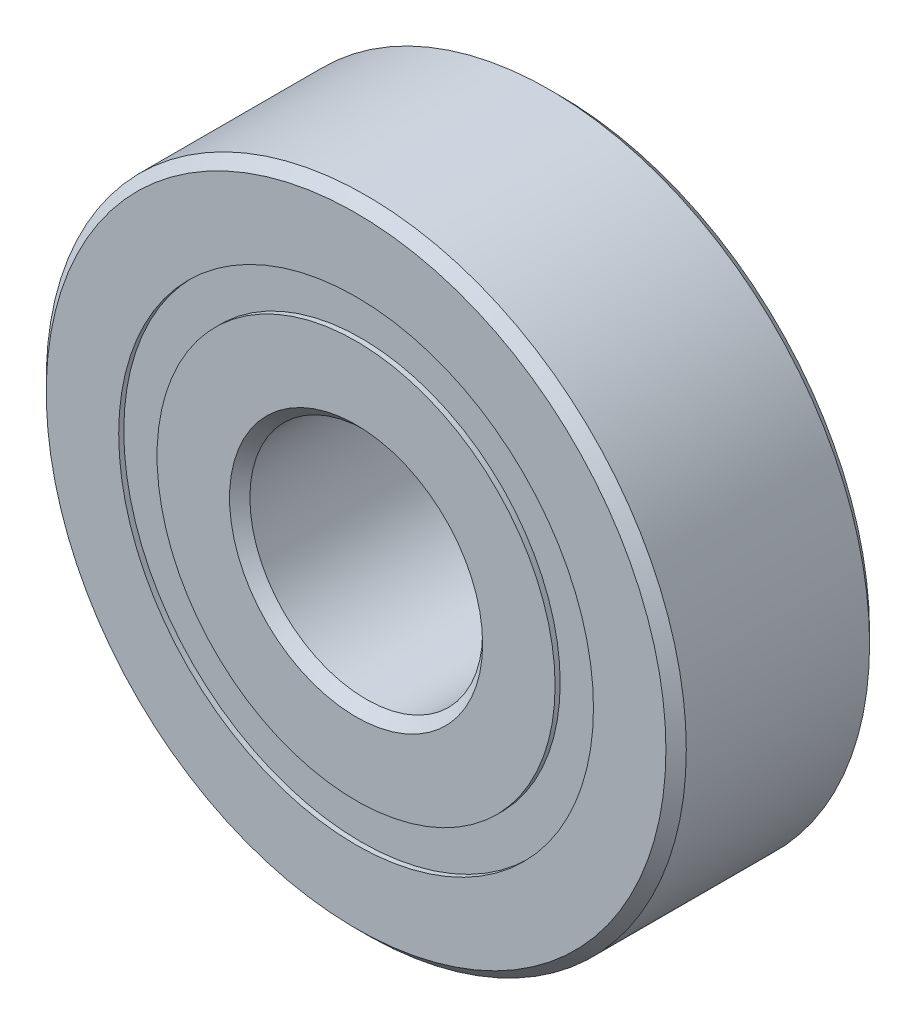
ISO-10303-21;
HEADER;
FILE_DESCRIPTION(('STEP AP214'),'2;1');
FILE_NAME('part.step','',(''),(''),'','','');
FILE_SCHEMA(('AUTOMOTIVE_DESIGN { 1 0 10303 214 1 1 1 1 }'));
ENDSEC;
DATA;
#1=APPLICATION_CONTEXT('core data for automotive mechanical design processes');
#2=APPLICATION_PROTOCOL_DEFINITION('international standard','automotive_design',2000,#1);
#3=PRODUCT_CONTEXT('',#1,'mechanical');
#4=PRODUCT('Part','Part','',(#3));
#5=PRODUCT_RELATED_PRODUCT_CATEGORY('part','',(#4));
#6=PRODUCT_DEFINITION_FORMATION('','',#4);
#7=PRODUCT_DEFINITION_CONTEXT('part definition',#1,'design');
#8=PRODUCT_DEFINITION('design','',#6,#7);
#9=PRODUCT_DEFINITION_SHAPE('','',#8);
#10=(LENGTH_UNIT() NAMED_UNIT(*) SI_UNIT(.MILLI.,.METRE.));
#11=(NAMED_UNIT(*) PLANE_ANGLE_UNIT() SI_UNIT($,.RADIAN.));
#12=(NAMED_UNIT(*) SI_UNIT($,.STERADIAN.) SOLID_ANGLE_UNIT());
#13=UNCERTAINTY_MEASURE_WITH_UNIT(LENGTH_MEASURE(1.E-05),#10,'distance_accuracy_value','');
#14=(GEOMETRIC_REPRESENTATION_CONTEXT(3) GLOBAL_UNCERTAINTY_ASSIGNED_CONTEXT((#13)) GLOBAL_UNIT_ASSIGNED_CONTEXT((#10,
#11,#12)) REPRESENTATION_CONTEXT('',''));
#15=CARTESIAN_POINT('',(0.,0.,0.));
#16=DIRECTION('',(0.,0.,1.));
#17=DIRECTION('',(1.,0.,0.));
#18=AXIS2_PLACEMENT_3D('',#15,#16,#17);
#19=CARTESIAN_POINT('',(0.,0.,3.5));
#20=DIRECTION('',(0.,0.,1.));
#21=DIRECTION('',(1.,0.,0.));
#22=AXIS2_PLACEMENT_3D('',#19,#20,#21);
#23=CYLINDRICAL_SURFACE('',#22,8.15934065934066);
#24=CARTESIAN_POINT('',(0.,0.,3.325));
#25=DIRECTION('',(0.,0.,1.));
#26=DIRECTION('',(1.,0.,0.));
#27=AXIS2_PLACEMENT_3D('',#24,#25,#26);
#28=CIRCLE('',#27,8.15934065934066);
#29=CARTESIAN_POINT('',(8.15934065934066,0.,3.325));
#30=VERTEX_POINT('',#29);
#31=EDGE_CURVE('P0_E43',#30,#30,#28,.T.);
#32=ORIENTED_EDGE('',*,*,#31,.F.);
#33=EDGE_LOOP('',(#32));
#34=FACE_BOUND('',#33,.T.);
#35=CARTESIAN_POINT('',(0.,0.,1.68952158656808));
#36=DIRECTION('',(0.,0.,1.));
#37=DIRECTION('',(1.,0.,0.));
#38=AXIS2_PLACEMENT_3D('',#35,#36,#37);
#39=CIRCLE('',#38,8.15934065934066);
#40=CARTESIAN_POINT('',(8.15934065934066,0.,1.68952158656808));
#41=VERTEX_POINT('',#40);
#42=EDGE_CURVE('P0_E11',#41,#41,#39,.T.);
#43=ORIENTED_EDGE('',*,*,#42,.T.);
#44=EDGE_LOOP('',(#43));
#45=FACE_BOUND('',#44,.T.);
#46=ADVANCED_FACE('P0_F16',(#34,#45),#23,.T.);
#47=CARTESIAN_POINT('',(0.,8.15934065934066,1.68952158656808));
#48=DIRECTION('',(0.,0.,1.));
#49=DIRECTION('',(1.,0.,0.));
#50=AXIS2_PLACEMENT_3D('',#47,#48,#49);
#51=PLANE('',#50);
#52=CARTESIAN_POINT('',(0.,0.,1.68952158656808));
#53=DIRECTION('',(0.,0.,1.));
#54=DIRECTION('',(1.,0.,0.));
#55=AXIS2_PLACEMENT_3D('',#52,#53,#54);
#56=CIRCLE('',#55,6.84065934065934);
#57=CARTESIAN_POINT('',(6.84065934065934,0.,1.68952158656808));
#58=VERTEX_POINT('',#57);
#59=EDGE_CURVE('P0_E19',#58,#58,#56,.T.);
#60=ORIENTED_EDGE('',*,*,#59,.T.);
#61=EDGE_LOOP('',(#60));
#62=FACE_BOUND('',#61,.T.);
#63=ORIENTED_EDGE('',*,*,#42,.F.);
#64=EDGE_LOOP('',(#63));
#65=FACE_BOUND('',#64,.T.);
#66=ADVANCED_FACE('P0_F100',(#62,#65),#51,.F.);
#67=CARTESIAN_POINT('',(0.,0.,3.5));
#68=DIRECTION('',(0.,0.,1.));
#69=DIRECTION('',(1.,0.,0.));
#70=AXIS2_PLACEMENT_3D('',#67,#68,#69);
#71=CYLINDRICAL_SURFACE('',#70,6.84065934065934);
#72=ORIENTED_EDGE('',*,*,#59,.F.);
#73=EDGE_LOOP('',(#72));
#74=FACE_BOUND('',#73,.T.);
#75=CARTESIAN_POINT('',(0.,0.,3.325));
#76=DIRECTION('',(0.,0.,1.));
#77=DIRECTION('',(1.,0.,0.));
#78=AXIS2_PLACEMENT_3D('',#75,#76,#77);
#79=CIRCLE('',#78,6.84065934065934);
#80=CARTESIAN_POINT('',(6.84065934065934,0.,3.325));
#81=VERTEX_POINT('',#80);
#82=EDGE_CURVE('P0_E48',#81,#81,#79,.T.);
#83=ORIENTED_EDGE('',*,*,#82,.T.);
#84=EDGE_LOOP('',(#83));
#85=FACE_BOUND('',#84,.T.);
#86=ADVANCED_FACE('P0_F49',(#74,#85),#71,.F.);
#87=CARTESIAN_POINT('',(0.,8.15934065934066,3.325));
#88=DIRECTION('',(0.,0.,-1.));
#89=DIRECTION('',(0.,-1.,0.));
#90=AXIS2_PLACEMENT_3D('',#87,#88,#89);
#91=PLANE('',#90);
#92=ORIENTED_EDGE('',*,*,#82,.F.);
#93=EDGE_LOOP('',(#92));
#94=FACE_BOUND('',#93,.T.);
#95=ORIENTED_EDGE('',*,*,#31,.T.);
#96=EDGE_LOOP('',(#95));
#97=FACE_BOUND('',#96,.T.);
#98=ADVANCED_FACE('P0_F84',(#94,#97),#91,.F.);
#99=CLOSED_SHELL('',(#46,#66,#86,#98));
#100=MANIFOLD_SOLID_BREP('P0_B1',#99);
#101=CARTESIAN_POINT('',(0.,0.,0.));
#102=DIRECTION('',(0.,0.,1.));
#103=DIRECTION('',(1.,0.,0.));
#104=AXIS2_PLACEMENT_3D('',#101,#102,#103);
#105=PLANE('',#104);
#106=CARTESIAN_POINT('',(0.,7.5,0.));
#107=DIRECTION('',(0.,0.,1.));
#108=DIRECTION('',(1.,0.,0.));
#109=AXIS2_PLACEMENT_3D('',#106,#107,#108);
#110=CIRCLE('',#109,1.68952158656808);
#111=CARTESIAN_POINT('',(1.68952158656808,7.5,0.));
#112=VERTEX_POINT('',#111);
#113=EDGE_CURVE('P1_E11',#112,#112,#110,.T.);
#114=ORIENTED_EDGE('',*,*,#113,.F.);
#115=EDGE_LOOP('',(#114));
#116=FACE_BOUND('',#115,.T.);
#117=ADVANCED_FACE('P1_F16',(#116),#105,.F.);
#118=CARTESIAN_POINT('',(0.,7.5,0.));
#119=DIRECTION('',(-1.,0.,0.));
#120=DIRECTION('',(0.,1.,0.));
#121=AXIS2_PLACEMENT_3D('',#118,#119,#120);
#122=SPHERICAL_SURFACE('',#121,1.68952158656808);
#123=CARTESIAN_POINT('',(0.,7.5,0.));
#124=DIRECTION('',(0.,0.,1.));
#125=DIRECTION('',(1.,0.,0.));
#126=AXIS2_PLACEMENT_3D('',#123,#124,#125);
#127=SPHERICAL_SURFACE('',#126,1.68952158656808);
#128=ORIENTED_EDGE('',*,*,#113,.T.);
#129=EDGE_LOOP('',(#128));
#130=FACE_BOUND('',#129,.T.);
#131=ADVANCED_FACE('P1_F18',(#130),#127,.T.);
#132=CLOSED_SHELL('',(#117,#131));
#133=MANIFOLD_SOLID_BREP('P1_B1',#132);
#134=CARTESIAN_POINT('',(0.,0.,0.));
#135=DIRECTION('',(0.,0.,1.));
#136=DIRECTION('',(1.,0.,0.));
#137=AXIS2_PLACEMENT_3D('',#134,#135,#136);
#138=PLANE('',#137);
#139=CARTESIAN_POINT('',(4.40838939219356,6.0676274578121,0.));
#140=DIRECTION('',(0.,0.,1.));
#141=DIRECTION('',(1.,0.,0.));
#142=AXIS2_PLACEMENT_3D('',#139,#140,#141);
#143=CIRCLE('',#142,1.68952158656808);
#144=CARTESIAN_POINT('',(6.09791097876164,6.0676274578121,0.));
#145=VERTEX_POINT('',#144);
#146=EDGE_CURVE('P2_E11',#145,#145,#143,.T.);
#147=ORIENTED_EDGE('',*,*,#146,.F.);
#148=EDGE_LOOP('',(#147));
#149=FACE_BOUND('',#148,.T.);
#150=ADVANCED_FACE('P2_F16',(#149),#138,.F.);
#151=CARTESIAN_POINT('',(4.40838939219356,6.0676274578121,0.));
#152=DIRECTION('',(-0.809016994374947,0.587785252292474,0.));
#153=DIRECTION('',(0.587785252292474,0.809016994374947,0.));
#154=AXIS2_PLACEMENT_3D('',#151,#152,#153);
#155=SPHERICAL_SURFACE('',#154,1.68952158656808);
#156=CARTESIAN_POINT('',(4.40838939219356,6.0676274578121,0.));
#157=DIRECTION('',(0.,0.,1.));
#158=DIRECTION('',(1.,0.,0.));
#159=AXIS2_PLACEMENT_3D('',#156,#157,#158);
#160=SPHERICAL_SURFACE('',#159,1.68952158656808);
#161=ORIENTED_EDGE('',*,*,#146,.T.);
#162=EDGE_LOOP('',(#161));
#163=FACE_BOUND('',#162,.T.);
#164=ADVANCED_FACE('P2_F30',(#163),#160,.T.);
#165=CLOSED_SHELL('',(#150,#164));
#166=MANIFOLD_SOLID_BREP('P2_B1',#165);
#167=CARTESIAN_POINT('',(0.,0.,0.));
#168=DIRECTION('',(0.,0.,1.));
#169=DIRECTION('',(1.,0.,0.));
#170=AXIS2_PLACEMENT_3D('',#167,#168,#169);
#171=PLANE('',#170);
#172=CARTESIAN_POINT('',(7.13292387221366,2.31762745781209,0.));
#173=DIRECTION('',(0.,0.,1.));
#174=DIRECTION('',(1.,0.,0.));
#175=AXIS2_PLACEMENT_3D('',#172,#173,#174);
#176=CIRCLE('',#175,1.68952158656808);
#177=CARTESIAN_POINT('',(8.82244545878174,2.31762745781209,0.));
#178=VERTEX_POINT('',#177);
#179=EDGE_CURVE('P3_E11',#178,#178,#176,.T.);
#180=ORIENTED_EDGE('',*,*,#179,.F.);
#181=EDGE_LOOP('',(#180));
#182=FACE_BOUND('',#181,.T.);
#183=ADVANCED_FACE('P3_F16',(#182),#171,.F.);
#184=CARTESIAN_POINT('',(7.13292387221366,2.31762745781209,0.));
#185=DIRECTION('',(-0.309016994374945,0.951056516295154,0.));
#186=DIRECTION('',(0.951056516295154,0.309016994374945,0.));
#187=AXIS2_PLACEMENT_3D('',#184,#185,#186);
#188=SPHERICAL_SURFACE('',#187,1.68952158656808);
#189=CARTESIAN_POINT('',(7.13292387221366,2.31762745781209,0.));
#190=DIRECTION('',(0.,0.,1.));
#191=DIRECTION('',(1.,0.,0.));
#192=AXIS2_PLACEMENT_3D('',#189,#190,#191);
#193=SPHERICAL_SURFACE('',#192,1.68952158656808);
#194=ORIENTED_EDGE('',*,*,#179,.T.);
#195=EDGE_LOOP('',(#194));
#196=FACE_BOUND('',#195,.T.);
#197=ADVANCED_FACE('P3_F30',(#196),#193,.T.);
#198=CLOSED_SHELL('',(#183,#197));
#199=MANIFOLD_SOLID_BREP('P3_B1',#198);
#200=CARTESIAN_POINT('',(0.,0.,0.));
#201=DIRECTION('',(0.,0.,1.));
#202=DIRECTION('',(1.,0.,0.));
#203=AXIS2_PLACEMENT_3D('',#200,#201,#202);
#204=PLANE('',#203);
#205=CARTESIAN_POINT('',(7.13292387221364,-2.31762745781214,0.));
#206=DIRECTION('',(0.,0.,1.));
#207=DIRECTION('',(1.,0.,0.));
#208=AXIS2_PLACEMENT_3D('',#205,#206,#207);
#209=CIRCLE('',#208,1.68952158656808);
#210=CARTESIAN_POINT('',(8.82244545878172,-2.31762745781214,0.));
#211=VERTEX_POINT('',#210);
#212=EDGE_CURVE('P4_E11',#211,#211,#209,.T.);
#213=ORIENTED_EDGE('',*,*,#212,.F.);
#214=EDGE_LOOP('',(#213));
#215=FACE_BOUND('',#214,.T.);
#216=ADVANCED_FACE('P4_F16',(#215),#204,.F.);
#217=CARTESIAN_POINT('',(7.13292387221364,-2.31762745781214,0.));
#218=DIRECTION('',(0.309016994374952,0.951056516295152,0.));
#219=DIRECTION('',(0.951056516295152,-0.309016994374952,0.));
#220=AXIS2_PLACEMENT_3D('',#217,#218,#219);
#221=SPHERICAL_SURFACE('',#220,1.68952158656808);
#222=CARTESIAN_POINT('',(7.13292387221364,-2.31762745781214,0.));
#223=DIRECTION('',(0.,0.,1.));
#224=DIRECTION('',(1.,0.,0.));
#225=AXIS2_PLACEMENT_3D('',#222,#223,#224);
#226=SPHERICAL_SURFACE('',#225,1.68952158656808);
#227=ORIENTED_EDGE('',*,*,#212,.T.);
#228=EDGE_LOOP('',(#227));
#229=FACE_BOUND('',#228,.T.);
#230=ADVANCED_FACE('P4_F27',(#229),#226,.T.);
#231=CLOSED_SHELL('',(#216,#230));
#232=MANIFOLD_SOLID_BREP('P4_B1',#231);
#233=CARTESIAN_POINT('',(0.,0.,0.));
#234=DIRECTION('',(0.,0.,1.));
#235=DIRECTION('',(1.,0.,0.));
#236=AXIS2_PLACEMENT_3D('',#233,#234,#235);
#237=PLANE('',#236);
#238=CARTESIAN_POINT('',(4.40838939219351,-6.06762745781213,0.));
#239=DIRECTION('',(0.,0.,1.));
#240=DIRECTION('',(1.,0.,0.));
#241=AXIS2_PLACEMENT_3D('',#238,#239,#240);
#242=CIRCLE('',#241,1.68952158656808);
#243=CARTESIAN_POINT('',(6.0979109787616,-6.06762745781213,0.));
#244=VERTEX_POINT('',#243);
#245=EDGE_CURVE('P5_E11',#244,#244,#242,.T.);
#246=ORIENTED_EDGE('',*,*,#245,.F.);
#247=EDGE_LOOP('',(#246));
#248=FACE_BOUND('',#247,.T.);
#249=ADVANCED_FACE('P5_F16',(#248),#237,.F.);
#250=CARTESIAN_POINT('',(4.40838939219351,-6.06762745781213,0.));
#251=DIRECTION('',(0.809016994374951,0.587785252292468,0.));
#252=DIRECTION('',(0.587785252292468,-0.809016994374951,0.));
#253=AXIS2_PLACEMENT_3D('',#250,#251,#252);
#254=SPHERICAL_SURFACE('',#253,1.68952158656808);
#255=CARTESIAN_POINT('',(4.40838939219351,-6.06762745781213,0.));
#256=DIRECTION('',(0.,0.,1.));
#257=DIRECTION('',(1.,0.,0.));
#258=AXIS2_PLACEMENT_3D('',#255,#256,#257);
#259=SPHERICAL_SURFACE('',#258,1.68952158656808);
#260=ORIENTED_EDGE('',*,*,#245,.T.);
#261=EDGE_LOOP('',(#260));
#262=FACE_BOUND('',#261,.T.);
#263=ADVANCED_FACE('P5_F30',(#262),#259,.T.);
#264=CLOSED_SHELL('',(#249,#263));
#265=MANIFOLD_SOLID_BREP('P5_B1',#264);
#266=CARTESIAN_POINT('',(0.,0.,0.));
#267=DIRECTION('',(0.,0.,1.));
#268=DIRECTION('',(1.,0.,0.));
#269=AXIS2_PLACEMENT_3D('',#266,#267,#268);
#270=PLANE('',#269);
#271=CARTESIAN_POINT('',(0.,-7.5,0.));
#272=DIRECTION('',(0.,0.,1.));
#273=DIRECTION('',(1.,0.,0.));
#274=AXIS2_PLACEMENT_3D('',#271,#272,#273);
#275=CIRCLE('',#274,1.68952158656808);
#276=CARTESIAN_POINT('',(1.68952158656803,-7.5,0.));
#277=VERTEX_POINT('',#276);
#278=EDGE_CURVE('P6_E11',#277,#277,#275,.T.);
#279=ORIENTED_EDGE('',*,*,#278,.F.);
#280=EDGE_LOOP('',(#279));
#281=FACE_BOUND('',#280,.T.);
#282=ADVANCED_FACE('P6_F16',(#281),#270,.F.);
#283=CARTESIAN_POINT('',(0.,-7.5,0.));
#284=DIRECTION('',(1.,0.,0.));
#285=DIRECTION('',(0.,-1.,0.));
#286=AXIS2_PLACEMENT_3D('',#283,#284,#285);
#287=SPHERICAL_SURFACE('',#286,1.68952158656808);
#288=CARTESIAN_POINT('',(0.,-7.5,0.));
#289=DIRECTION('',(0.,0.,1.));
#290=DIRECTION('',(1.,0.,0.));
#291=AXIS2_PLACEMENT_3D('',#288,#289,#290);
#292=SPHERICAL_SURFACE('',#291,1.68952158656808);
#293=ORIENTED_EDGE('',*,*,#278,.T.);
#294=EDGE_LOOP('',(#293));
#295=FACE_BOUND('',#294,.T.);
#296=ADVANCED_FACE('P6_F18',(#295),#292,.T.);
#297=CLOSED_SHELL('',(#282,#296));
#298=MANIFOLD_SOLID_BREP('P6_B1',#297);
#299=CARTESIAN_POINT('',(0.,0.,0.));
#300=DIRECTION('',(0.,0.,1.));
#301=DIRECTION('',(1.,0.,0.));
#302=AXIS2_PLACEMENT_3D('',#299,#300,#301);
#303=PLANE('',#302);
#304=CARTESIAN_POINT('',(-4.4083893921936,-6.06762745781207,0.));
#305=DIRECTION('',(0.,0.,1.));
#306=DIRECTION('',(1.,0.,0.));
#307=AXIS2_PLACEMENT_3D('',#304,#305,#306);
#308=CIRCLE('',#307,1.68952158656808);
#309=CARTESIAN_POINT('',(-2.71886780562552,-6.06762745781207,0.));
#310=VERTEX_POINT('',#309);
#311=EDGE_CURVE('P7_E11',#310,#310,#308,.T.);
#312=ORIENTED_EDGE('',*,*,#311,.F.);
#313=EDGE_LOOP('',(#312));
#314=FACE_BOUND('',#313,.T.);
#315=ADVANCED_FACE('P7_F16',(#314),#303,.F.);
#316=CARTESIAN_POINT('',(-4.4083893921936,-6.06762745781207,0.));
#317=DIRECTION('',(0.809016994374942,-0.58778525229248,0.));
#318=DIRECTION('',(-0.58778525229248,-0.809016994374942,0.));
#319=AXIS2_PLACEMENT_3D('',#316,#317,#318);
#320=SPHERICAL_SURFACE('',#319,1.68952158656808);
#321=CARTESIAN_POINT('',(-4.4083893921936,-6.06762745781207,0.));
#322=DIRECTION('',(0.,0.,1.));
#323=DIRECTION('',(1.,0.,0.));
#324=AXIS2_PLACEMENT_3D('',#321,#322,#323);
#325=SPHERICAL_SURFACE('',#324,1.68952158656808);
#326=ORIENTED_EDGE('',*,*,#311,.T.);
#327=EDGE_LOOP('',(#326));
#328=FACE_BOUND('',#327,.T.);
#329=ADVANCED_FACE('P7_F18',(#328),#325,.T.);
#330=CLOSED_SHELL('',(#315,#329));
#331=MANIFOLD_SOLID_BREP('P7_B1',#330);
#332=CARTESIAN_POINT('',(0.,0.,0.));
#333=DIRECTION('',(0.,0.,1.));
#334=DIRECTION('',(1.,0.,0.));
#335=AXIS2_PLACEMENT_3D('',#332,#333,#334);
#336=PLANE('',#335);
#337=CARTESIAN_POINT('',(-7.13292387221367,-2.31762745781203,0.));
#338=DIRECTION('',(0.,0.,1.));
#339=DIRECTION('',(1.,0.,0.));
#340=AXIS2_PLACEMENT_3D('',#337,#338,#339);
#341=CIRCLE('',#340,1.68952158656808);
#342=CARTESIAN_POINT('',(-5.44340228564559,-2.31762745781203,0.));
#343=VERTEX_POINT('',#342);
#344=EDGE_CURVE('P8_E11',#343,#343,#341,.T.);
#345=ORIENTED_EDGE('',*,*,#344,.F.);
#346=EDGE_LOOP('',(#345));
#347=FACE_BOUND('',#346,.T.);
#348=ADVANCED_FACE('P8_F16',(#347),#336,.F.);
#349=CARTESIAN_POINT('',(-7.13292387221367,-2.31762745781203,0.));
#350=DIRECTION('',(0.309016994374938,-0.951056516295157,0.));
#351=DIRECTION('',(-0.951056516295157,-0.309016994374938,0.));
#352=AXIS2_PLACEMENT_3D('',#349,#350,#351);
#353=SPHERICAL_SURFACE('',#352,1.68952158656808);
#354=CARTESIAN_POINT('',(-7.13292387221367,-2.31762745781203,0.));
#355=DIRECTION('',(0.,0.,1.));
#356=DIRECTION('',(1.,0.,0.));
#357=AXIS2_PLACEMENT_3D('',#354,#355,#356);
#358=SPHERICAL_SURFACE('',#357,1.68952158656808);
#359=ORIENTED_EDGE('',*,*,#344,.T.);
#360=EDGE_LOOP('',(#359));
#361=FACE_BOUND('',#360,.T.);
#362=ADVANCED_FACE('P8_F30',(#361),#358,.T.);
#363=CLOSED_SHELL('',(#348,#362));
#364=MANIFOLD_SOLID_BREP('P8_B1',#363);
#365=CARTESIAN_POINT('',(0.,0.,0.));
#366=DIRECTION('',(0.,0.,1.));
#367=DIRECTION('',(1.,0.,0.));
#368=AXIS2_PLACEMENT_3D('',#365,#366,#367);
#369=PLANE('',#368);
#370=CARTESIAN_POINT('',(-7.13292387221363,2.31762745781218,0.));
#371=DIRECTION('',(0.,0.,1.));
#372=DIRECTION('',(1.,0.,0.));
#373=AXIS2_PLACEMENT_3D('',#370,#371,#372);
#374=CIRCLE('',#373,1.68952158656808);
#375=CARTESIAN_POINT('',(-5.44340228564554,2.31762745781218,0.));
#376=VERTEX_POINT('',#375);
#377=EDGE_CURVE('P9_E11',#376,#376,#374,.T.);
#378=ORIENTED_EDGE('',*,*,#377,.F.);
#379=EDGE_LOOP('',(#378));
#380=FACE_BOUND('',#379,.T.);
#381=ADVANCED_FACE('P9_F16',(#380),#369,.F.);
#382=CARTESIAN_POINT('',(-7.13292387221363,2.31762745781218,0.));
#383=DIRECTION('',(-0.309016994374958,-0.95105651629515,0.));
#384=DIRECTION('',(-0.95105651629515,0.309016994374958,0.));
#385=AXIS2_PLACEMENT_3D('',#382,#383,#384);
#386=SPHERICAL_SURFACE('',#385,1.68952158656808);
#387=CARTESIAN_POINT('',(-7.13292387221363,2.31762745781218,0.));
#388=DIRECTION('',(0.,0.,1.));
#389=DIRECTION('',(1.,0.,0.));
#390=AXIS2_PLACEMENT_3D('',#387,#388,#389);
#391=SPHERICAL_SURFACE('',#390,1.68952158656808);
#392=ORIENTED_EDGE('',*,*,#377,.T.);
#393=EDGE_LOOP('',(#392));
#394=FACE_BOUND('',#393,.T.);
#395=ADVANCED_FACE('P9_F30',(#394),#391,.T.);
#396=CLOSED_SHELL('',(#381,#395));
#397=MANIFOLD_SOLID_BREP('P9_B1',#396);
#398=CARTESIAN_POINT('',(0.,0.,0.));
#399=DIRECTION('',(0.,0.,1.));
#400=DIRECTION('',(1.,0.,0.));
#401=AXIS2_PLACEMENT_3D('',#398,#399,#400);
#402=PLANE('',#401);
#403=CARTESIAN_POINT('',(-4.40838939219347,6.06762745781216,0.));
#404=DIRECTION('',(0.,0.,1.));
#405=DIRECTION('',(1.,0.,0.));
#406=AXIS2_PLACEMENT_3D('',#403,#404,#405);
#407=CIRCLE('',#406,1.68952158656808);
#408=CARTESIAN_POINT('',(-2.71886780562539,6.06762745781216,0.));
#409=VERTEX_POINT('',#408);
#410=EDGE_CURVE('P10_E11',#409,#409,#407,.T.);
#411=ORIENTED_EDGE('',*,*,#410,.F.);
#412=EDGE_LOOP('',(#411));
#413=FACE_BOUND('',#412,.T.);
#414=ADVANCED_FACE('P10_F16',(#413),#402,.F.);
#415=CARTESIAN_POINT('',(-4.40838939219347,6.06762745781216,0.));
#416=DIRECTION('',(-0.809016994374955,-0.587785252292463,0.));
#417=DIRECTION('',(-0.587785252292463,0.809016994374955,0.));
#418=AXIS2_PLACEMENT_3D('',#415,#416,#417);
#419=SPHERICAL_SURFACE('',#418,1.68952158656808);
#420=CARTESIAN_POINT('',(-4.40838939219347,6.06762745781216,0.));
#421=DIRECTION('',(0.,0.,1.));
#422=DIRECTION('',(1.,0.,0.));
#423=AXIS2_PLACEMENT_3D('',#420,#421,#422);
#424=SPHERICAL_SURFACE('',#423,1.68952158656808);
#425=ORIENTED_EDGE('',*,*,#410,.T.);
#426=EDGE_LOOP('',(#425));
#427=FACE_BOUND('',#426,.T.);
#428=ADVANCED_FACE('P10_F30',(#427),#424,.T.);
#429=CLOSED_SHELL('',(#414,#428));
#430=MANIFOLD_SOLID_BREP('P10_B1',#429);
#431=CARTESIAN_POINT('',(0.,10.65,-3.5));
#432=DIRECTION('',(0.,0.,1.));
#433=DIRECTION('',(1.,0.,0.));
#434=AXIS2_PLACEMENT_3D('',#431,#432,#433);
#435=PLANE('',#434);
#436=CARTESIAN_POINT('',(0.,0.,-3.5));
#437=DIRECTION('',(0.,0.,1.));
#438=DIRECTION('',(1.,0.,0.));
#439=AXIS2_PLACEMENT_3D('',#436,#437,#438);
#440=CIRCLE('',#439,8.15934065934066);
#441=CARTESIAN_POINT('',(8.15934065934066,0.,-3.5));
#442=VERTEX_POINT('',#441);
#443=EDGE_CURVE('P11_E176',#442,#442,#440,.T.);
#444=ORIENTED_EDGE('',*,*,#443,.T.);
#445=EDGE_LOOP('',(#444));
#446=FACE_BOUND('',#445,.T.);
#447=CARTESIAN_POINT('',(0.,0.,-3.5));
#448=DIRECTION('',(0.,0.,1.));
#449=DIRECTION('',(1.,0.,0.));
#450=AXIS2_PLACEMENT_3D('',#447,#448,#449);
#451=CIRCLE('',#450,10.65);
#452=CARTESIAN_POINT('',(10.65,0.,-3.5));
#453=VERTEX_POINT('',#452);
#454=EDGE_CURVE('P11_E11',#453,#453,#451,.T.);
#455=ORIENTED_EDGE('',*,*,#454,.F.);
#456=EDGE_LOOP('',(#455));
#457=FACE_BOUND('',#456,.T.);
#458=ADVANCED_FACE('P11_F16',(#446,#457),#435,.F.);
#459=CARTESIAN_POINT('',(0.,0.,-3.15));
#460=DIRECTION('',(0.,0.,1.));
#461=DIRECTION('',(-1.,0.,0.));
#462=AXIS2_PLACEMENT_3D('',#459,#460,#461);
#463=CONICAL_SURFACE('',#462,11.,0.785398163397448);
#464=ORIENTED_EDGE('',*,*,#454,.T.);
#465=EDGE_LOOP('',(#464));
#466=FACE_BOUND('',#465,.T.);
#467=CARTESIAN_POINT('',(0.,0.,-3.15));
#468=DIRECTION('',(0.,0.,1.));
#469=DIRECTION('',(1.,0.,0.));
#470=AXIS2_PLACEMENT_3D('',#467,#468,#469);
#471=CIRCLE('',#470,11.);
#472=CARTESIAN_POINT('',(11.,0.,-3.15));
#473=VERTEX_POINT('',#472);
#474=EDGE_CURVE('P11_E123',#473,#473,#471,.T.);
#475=ORIENTED_EDGE('',*,*,#474,.F.);
#476=EDGE_LOOP('',(#475));
#477=FACE_BOUND('',#476,.T.);
#478=ADVANCED_FACE('P11_F311',(#466,#477),#463,.T.);
#479=CARTESIAN_POINT('',(0.,10.65,3.5));
#480=DIRECTION('',(0.,0.,-1.));
#481=DIRECTION('',(0.,-1.,0.));
#482=AXIS2_PLACEMENT_3D('',#479,#480,#481);
#483=PLANE('',#482);
#484=CARTESIAN_POINT('',(0.,0.,3.5));
#485=DIRECTION('',(0.,0.,1.));
#486=DIRECTION('',(1.,0.,0.));
#487=AXIS2_PLACEMENT_3D('',#484,#485,#486);
#488=CIRCLE('',#487,8.15934065934066);
#489=CARTESIAN_POINT('',(8.15934065934066,0.,3.5));
#490=VERTEX_POINT('',#489);
#491=EDGE_CURVE('P11_E27',#490,#490,#488,.T.);
#492=ORIENTED_EDGE('',*,*,#491,.F.);
#493=EDGE_LOOP('',(#492));
#494=FACE_BOUND('',#493,.T.);
#495=CARTESIAN_POINT('',(0.,0.,3.5));
#496=DIRECTION('',(0.,0.,1.));
#497=DIRECTION('',(1.,0.,0.));
#498=AXIS2_PLACEMENT_3D('',#495,#496,#497);
#499=CIRCLE('',#498,10.65);
#500=CARTESIAN_POINT('',(10.65,0.,3.5));
#501=VERTEX_POINT('',#500);
#502=EDGE_CURVE('P11_E117',#501,#501,#499,.T.);
#503=ORIENTED_EDGE('',*,*,#502,.T.);
#504=EDGE_LOOP('',(#503));
#505=FACE_BOUND('',#504,.T.);
#506=ADVANCED_FACE('P11_F375',(#494,#505),#483,.F.);
#507=CARTESIAN_POINT('',(0.,0.,3.5));
#508=DIRECTION('',(0.,0.,1.));
#509=DIRECTION('',(1.,0.,0.));
#510=AXIS2_PLACEMENT_3D('',#507,#508,#509);
#511=CYLINDRICAL_SURFACE('',#510,8.15934065934066);
#512=CARTESIAN_POINT('',(0.,0.,1.55555555555556));
#513=DIRECTION('',(0.,0.,1.));
#514=DIRECTION('',(1.,0.,0.));
#515=AXIS2_PLACEMENT_3D('',#512,#513,#514);
#516=CIRCLE('',#515,8.15934065934066);
#517=CARTESIAN_POINT('',(8.15934065934066,0.,1.55555555555556));
#518=VERTEX_POINT('',#517);
#519=EDGE_CURVE('P11_E130',#518,#518,#516,.T.);
#520=ORIENTED_EDGE('',*,*,#519,.F.);
#521=EDGE_LOOP('',(#520));
#522=FACE_BOUND('',#521,.T.);
#523=ORIENTED_EDGE('',*,*,#491,.T.);
#524=EDGE_LOOP('',(#523));
#525=FACE_BOUND('',#524,.T.);
#526=ADVANCED_FACE('P11_F321',(#522,#525),#511,.F.);
#527=CARTESIAN_POINT('',(0.,0.,0.));
#528=DIRECTION('',(0.,0.,1.));
#529=DIRECTION('',(1.,0.,0.));
#530=AXIS2_PLACEMENT_3D('',#527,#528,#529);
#531=TOROIDAL_SURFACE('',#530,7.5,1.68952158656808);
#532=ORIENTED_EDGE('',*,*,#519,.T.);
#533=EDGE_LOOP('',(#532));
#534=FACE_BOUND('',#533,.T.);
#535=CARTESIAN_POINT('',(0.,0.,-1.55555555555556));
#536=DIRECTION('',(0.,0.,1.));
#537=DIRECTION('',(1.,0.,0.));
#538=AXIS2_PLACEMENT_3D('',#535,#536,#537);
#539=CIRCLE('',#538,8.15934065934066);
#540=CARTESIAN_POINT('',(8.15934065934066,0.,-1.55555555555556));
#541=VERTEX_POINT('',#540);
#542=EDGE_CURVE('P11_E150',#541,#541,#539,.T.);
#543=ORIENTED_EDGE('',*,*,#542,.F.);
#544=EDGE_LOOP('',(#543));
#545=FACE_BOUND('',#544,.T.);
#546=ADVANCED_FACE('P11_F131',(#534,#545),#531,.F.);
#547=CARTESIAN_POINT('',(0.,0.,3.5));
#548=DIRECTION('',(0.,0.,1.));
#549=DIRECTION('',(1.,0.,0.));
#550=AXIS2_PLACEMENT_3D('',#547,#548,#549);
#551=CYLINDRICAL_SURFACE('',#550,11.);
#552=CARTESIAN_POINT('',(0.,0.,3.15));
#553=DIRECTION('',(0.,0.,1.));
#554=DIRECTION('',(1.,0.,0.));
#555=AXIS2_PLACEMENT_3D('',#552,#553,#554);
#556=CIRCLE('',#555,11.);
#557=CARTESIAN_POINT('',(11.,0.,3.15));
#558=VERTEX_POINT('',#557);
#559=EDGE_CURVE('P11_E147',#558,#558,#556,.T.);
#560=ORIENTED_EDGE('',*,*,#559,.F.);
#561=EDGE_LOOP('',(#560));
#562=FACE_BOUND('',#561,.T.);
#563=ORIENTED_EDGE('',*,*,#474,.T.);
#564=EDGE_LOOP('',(#563));
#565=FACE_BOUND('',#564,.T.);
#566=ADVANCED_FACE('P11_F320',(#562,#565),#551,.T.);
#567=CARTESIAN_POINT('',(0.,0.,3.15));
#568=DIRECTION('',(0.,0.,-1.));
#569=DIRECTION('',(-1.,0.,0.));
#570=AXIS2_PLACEMENT_3D('',#567,#568,#569);
#571=CONICAL_SURFACE('',#570,11.,0.785398163397448);
#572=ORIENTED_EDGE('',*,*,#502,.F.);
#573=EDGE_LOOP('',(#572));
#574=FACE_BOUND('',#573,.T.);
#575=ORIENTED_EDGE('',*,*,#559,.T.);
#576=EDGE_LOOP('',(#575));
#577=FACE_BOUND('',#576,.T.);
#578=ADVANCED_FACE('P11_F354',(#574,#577),#571,.T.);
#579=CARTESIAN_POINT('',(0.,0.,-3.5));
#580=DIRECTION('',(0.,0.,-1.));
#581=DIRECTION('',(1.,0.,0.));
#582=AXIS2_PLACEMENT_3D('',#579,#580,#581);
#583=CYLINDRICAL_SURFACE('',#582,8.15934065934066);
#584=ORIENTED_EDGE('',*,*,#542,.T.);
#585=EDGE_LOOP('',(#584));
#586=FACE_BOUND('',#585,.T.);
#587=CARTESIAN_POINT('',(0.,0.,-1.68952158656808));
#588=DIRECTION('',(0.,0.,1.));
#589=DIRECTION('',(-1.,0.,0.));
#590=AXIS2_PLACEMENT_3D('',#587,#588,#589);
#591=CIRCLE('',#590,8.15934065934066);
#592=CARTESIAN_POINT('',(-8.15934065934066,0.,-1.68952158656808));
#593=VERTEX_POINT('',#592);
#594=EDGE_CURVE('P11_E158',#593,#593,#591,.T.);
#595=ORIENTED_EDGE('',*,*,#594,.F.);
#596=EDGE_LOOP('',(#595));
#597=FACE_BOUND('',#596,.T.);
#598=ADVANCED_FACE('P11_F358',(#586,#597),#583,.F.);
#599=CARTESIAN_POINT('',(0.,0.,-3.5));
#600=DIRECTION('',(0.,0.,-1.));
#601=DIRECTION('',(1.,0.,0.));
#602=AXIS2_PLACEMENT_3D('',#599,#600,#601);
#603=CYLINDRICAL_SURFACE('',#602,8.15934065934066);
#604=ORIENTED_EDGE('',*,*,#443,.F.);
#605=EDGE_LOOP('',(#604));
#606=FACE_BOUND('',#605,.T.);
#607=CARTESIAN_POINT('',(0.,0.,-3.325));
#608=DIRECTION('',(0.,0.,1.));
#609=DIRECTION('',(1.,0.,0.));
#610=AXIS2_PLACEMENT_3D('',#607,#608,#609);
#611=CIRCLE('',#610,8.15934065934066);
#612=CARTESIAN_POINT('',(8.15934065934066,0.,-3.325));
#613=VERTEX_POINT('',#612);
#614=EDGE_CURVE('P11_E65',#613,#613,#611,.T.);
#615=ORIENTED_EDGE('',*,*,#614,.T.);
#616=EDGE_LOOP('',(#615));
#617=FACE_BOUND('',#616,.T.);
#618=ADVANCED_FACE('P11_F407',(#606,#617),#603,.F.);
#619=CARTESIAN_POINT('',(0.,8.15934065934066,-1.68952158656808));
#620=DIRECTION('',(0.,0.,-1.));
#621=DIRECTION('',(0.,-1.,0.));
#622=AXIS2_PLACEMENT_3D('',#619,#620,#621);
#623=PLANE('',#622);
#624=CARTESIAN_POINT('',(0.,0.,-1.68952158656808));
#625=DIRECTION('',(0.,0.,-1.));
#626=DIRECTION('',(-1.,0.,0.));
#627=AXIS2_PLACEMENT_3D('',#624,#625,#626);
#628=CIRCLE('',#627,6.84065934065934);
#629=CARTESIAN_POINT('',(-6.84065934065934,0.,-1.68952158656808));
#630=VERTEX_POINT('',#629);
#631=EDGE_CURVE('P11_E163',#630,#630,#628,.T.);
#632=ORIENTED_EDGE('',*,*,#631,.T.);
#633=EDGE_LOOP('',(#632));
#634=FACE_BOUND('',#633,.T.);
#635=ORIENTED_EDGE('',*,*,#594,.T.);
#636=EDGE_LOOP('',(#635));
#637=FACE_BOUND('',#636,.T.);
#638=ADVANCED_FACE('P11_F18',(#634,#637),#623,.F.);
#639=CARTESIAN_POINT('',(0.,8.15934065934066,-3.325));
#640=DIRECTION('',(0.,0.,1.));
#641=DIRECTION('',(1.,0.,0.));
#642=AXIS2_PLACEMENT_3D('',#639,#640,#641);
#643=PLANE('',#642);
#644=CARTESIAN_POINT('',(0.,0.,-3.325));
#645=DIRECTION('',(0.,0.,1.));
#646=DIRECTION('',(1.,0.,0.));
#647=AXIS2_PLACEMENT_3D('',#644,#645,#646);
#648=CIRCLE('',#647,6.84065934065934);
#649=CARTESIAN_POINT('',(6.84065934065934,0.,-3.325));
#650=VERTEX_POINT('',#649);
#651=EDGE_CURVE('P11_E99',#650,#650,#648,.T.);
#652=ORIENTED_EDGE('',*,*,#651,.T.);
#653=EDGE_LOOP('',(#652));
#654=FACE_BOUND('',#653,.T.);
#655=ORIENTED_EDGE('',*,*,#614,.F.);
#656=EDGE_LOOP('',(#655));
#657=FACE_BOUND('',#656,.T.);
#658=ADVANCED_FACE('P11_F398',(#654,#657),#643,.F.);
#659=CARTESIAN_POINT('',(0.,0.,-3.5));
#660=DIRECTION('',(0.,0.,-1.));
#661=DIRECTION('',(1.,0.,0.));
#662=AXIS2_PLACEMENT_3D('',#659,#660,#661);
#663=CONICAL_SURFACE('',#662,4.35,0.785398163397452);
#664=CARTESIAN_POINT('',(0.,0.,-3.15));
#665=DIRECTION('',(0.,0.,1.));
#666=DIRECTION('',(1.,0.,0.));
#667=AXIS2_PLACEMENT_3D('',#664,#665,#666);
#668=CIRCLE('',#667,4.);
#669=CARTESIAN_POINT('',(4.,0.,-3.15));
#670=VERTEX_POINT('',#669);
#671=EDGE_CURVE('P11_E145',#670,#670,#668,.T.);
#672=ORIENTED_EDGE('',*,*,#671,.T.);
#673=EDGE_LOOP('',(#672));
#674=FACE_BOUND('',#673,.T.);
#675=CARTESIAN_POINT('',(0.,0.,-3.5));
#676=DIRECTION('',(0.,0.,1.));
#677=DIRECTION('',(1.,0.,0.));
#678=AXIS2_PLACEMENT_3D('',#675,#676,#677);
#679=CIRCLE('',#678,4.35);
#680=CARTESIAN_POINT('',(4.35,0.,-3.5));
#681=VERTEX_POINT('',#680);
#682=EDGE_CURVE('P11_E78',#681,#681,#679,.T.);
#683=ORIENTED_EDGE('',*,*,#682,.F.);
#684=EDGE_LOOP('',(#683));
#685=FACE_BOUND('',#684,.T.);
#686=ADVANCED_FACE('P11_F338',(#674,#685),#663,.F.);
#687=CARTESIAN_POINT('',(0.,6.84065934065934,-3.5));
#688=DIRECTION('',(0.,0.,1.));
#689=DIRECTION('',(1.,0.,0.));
#690=AXIS2_PLACEMENT_3D('',#687,#688,#689);
#691=PLANE('',#690);
#692=ORIENTED_EDGE('',*,*,#682,.T.);
#693=EDGE_LOOP('',(#692));
#694=FACE_BOUND('',#693,.T.);
#695=CARTESIAN_POINT('',(0.,0.,-3.5));
#696=DIRECTION('',(0.,0.,1.));
#697=DIRECTION('',(1.,0.,0.));
#698=AXIS2_PLACEMENT_3D('',#695,#696,#697);
#699=CIRCLE('',#698,6.84065934065934);
#700=CARTESIAN_POINT('',(6.84065934065934,0.,-3.5));
#701=VERTEX_POINT('',#700);
#702=EDGE_CURVE('P11_E93',#701,#701,#699,.T.);
#703=ORIENTED_EDGE('',*,*,#702,.F.);
#704=EDGE_LOOP('',(#703));
#705=FACE_BOUND('',#704,.T.);
#706=ADVANCED_FACE('P11_F333',(#694,#705),#691,.F.);
#707=CARTESIAN_POINT('',(0.,0.,3.5));
#708=DIRECTION('',(0.,0.,1.));
#709=DIRECTION('',(1.,0.,0.));
#710=AXIS2_PLACEMENT_3D('',#707,#708,#709);
#711=CONICAL_SURFACE('',#710,4.35,0.785398163397452);
#712=CARTESIAN_POINT('',(0.,0.,3.15));
#713=DIRECTION('',(0.,0.,1.));
#714=DIRECTION('',(1.,0.,0.));
#715=AXIS2_PLACEMENT_3D('',#712,#713,#714);
#716=CIRCLE('',#715,4.);
#717=CARTESIAN_POINT('',(4.,0.,3.15));
#718=VERTEX_POINT('',#717);
#719=EDGE_CURVE('P11_E153',#718,#718,#716,.T.);
#720=ORIENTED_EDGE('',*,*,#719,.F.);
#721=EDGE_LOOP('',(#720));
#722=FACE_BOUND('',#721,.T.);
#723=CARTESIAN_POINT('',(0.,0.,3.5));
#724=DIRECTION('',(0.,0.,1.));
#725=DIRECTION('',(1.,0.,0.));
#726=AXIS2_PLACEMENT_3D('',#723,#724,#725);
#727=CIRCLE('',#726,4.35);
#728=CARTESIAN_POINT('',(4.35,0.,3.5));
#729=VERTEX_POINT('',#728);
#730=EDGE_CURVE('P11_E20',#729,#729,#727,.T.);
#731=ORIENTED_EDGE('',*,*,#730,.T.);
#732=EDGE_LOOP('',(#731));
#733=FACE_BOUND('',#732,.T.);
#734=ADVANCED_FACE('P11_F337',(#722,#733),#711,.F.);
#735=CARTESIAN_POINT('',(0.,0.,3.5));
#736=DIRECTION('',(0.,0.,1.));
#737=DIRECTION('',(1.,0.,0.));
#738=AXIS2_PLACEMENT_3D('',#735,#736,#737);
#739=CYLINDRICAL_SURFACE('',#738,4.);
#740=ORIENTED_EDGE('',*,*,#719,.T.);
#741=EDGE_LOOP('',(#740));
#742=FACE_BOUND('',#741,.T.);
#743=ORIENTED_EDGE('',*,*,#671,.F.);
#744=EDGE_LOOP('',(#743));
#745=FACE_BOUND('',#744,.T.);
#746=ADVANCED_FACE('P11_F348',(#742,#745),#739,.F.);
#747=CARTESIAN_POINT('',(0.,0.,0.));
#748=DIRECTION('',(0.,0.,1.));
#749=DIRECTION('',(1.,0.,0.));
#750=AXIS2_PLACEMENT_3D('',#747,#748,#749);
#751=TOROIDAL_SURFACE('',#750,7.5,1.68952158656808);
#752=CARTESIAN_POINT('',(0.,0.,1.55555555555556));
#753=DIRECTION('',(0.,0.,1.));
#754=DIRECTION('',(1.,0.,0.));
#755=AXIS2_PLACEMENT_3D('',#752,#753,#754);
#756=CIRCLE('',#755,6.84065934065934);
#757=CARTESIAN_POINT('',(6.84065934065934,0.,1.55555555555556));
#758=VERTEX_POINT('',#757);
#759=EDGE_CURVE('P11_E177',#758,#758,#756,.T.);
#760=ORIENTED_EDGE('',*,*,#759,.F.);
#761=EDGE_LOOP('',(#760));
#762=FACE_BOUND('',#761,.T.);
#763=CARTESIAN_POINT('',(0.,0.,-1.55555555555556));
#764=DIRECTION('',(0.,0.,1.));
#765=DIRECTION('',(1.,0.,0.));
#766=AXIS2_PLACEMENT_3D('',#763,#764,#765);
#767=CIRCLE('',#766,6.84065934065934);
#768=CARTESIAN_POINT('',(6.84065934065934,0.,-1.55555555555556));
#769=VERTEX_POINT('',#768);
#770=EDGE_CURVE('P11_E159',#769,#769,#767,.T.);
#771=ORIENTED_EDGE('',*,*,#770,.T.);
#772=EDGE_LOOP('',(#771));
#773=FACE_BOUND('',#772,.T.);
#774=ADVANCED_FACE('P11_F343',(#762,#773),#751,.F.);
#775=CARTESIAN_POINT('',(0.,0.,3.5));
#776=DIRECTION('',(0.,0.,1.));
#777=DIRECTION('',(1.,0.,0.));
#778=AXIS2_PLACEMENT_3D('',#775,#776,#777);
#779=CYLINDRICAL_SURFACE('',#778,6.84065934065934);
#780=CARTESIAN_POINT('',(0.,0.,3.5));
#781=DIRECTION('',(0.,0.,1.));
#782=DIRECTION('',(1.,0.,0.));
#783=AXIS2_PLACEMENT_3D('',#780,#781,#782);
#784=CIRCLE('',#783,6.84065934065934);
#785=CARTESIAN_POINT('',(6.84065934065934,0.,3.5));
#786=VERTEX_POINT('',#785);
#787=EDGE_CURVE('P11_E162',#786,#786,#784,.T.);
#788=ORIENTED_EDGE('',*,*,#787,.F.);
#789=EDGE_LOOP('',(#788));
#790=FACE_BOUND('',#789,.T.);
#791=ORIENTED_EDGE('',*,*,#759,.T.);
#792=EDGE_LOOP('',(#791));
#793=FACE_BOUND('',#792,.T.);
#794=ADVANCED_FACE('P11_F347',(#790,#793),#779,.T.);
#795=CARTESIAN_POINT('',(0.,6.84065934065934,3.5));
#796=DIRECTION('',(0.,0.,-1.));
#797=DIRECTION('',(0.,-1.,0.));
#798=AXIS2_PLACEMENT_3D('',#795,#796,#797);
#799=PLANE('',#798);
#800=ORIENTED_EDGE('',*,*,#730,.F.);
#801=EDGE_LOOP('',(#800));
#802=FACE_BOUND('',#801,.T.);
#803=ORIENTED_EDGE('',*,*,#787,.T.);
#804=EDGE_LOOP('',(#803));
#805=FACE_BOUND('',#804,.T.);
#806=ADVANCED_FACE('P11_F302',(#802,#805),#799,.F.);
#807=CARTESIAN_POINT('',(0.,0.,-3.5));
#808=DIRECTION('',(0.,0.,-1.));
#809=DIRECTION('',(1.,0.,0.));
#810=AXIS2_PLACEMENT_3D('',#807,#808,#809);
#811=CYLINDRICAL_SURFACE('',#810,6.84065934065934);
#812=ORIENTED_EDGE('',*,*,#770,.F.);
#813=EDGE_LOOP('',(#812));
#814=FACE_BOUND('',#813,.T.);
#815=ORIENTED_EDGE('',*,*,#631,.F.);
#816=EDGE_LOOP('',(#815));
#817=FACE_BOUND('',#816,.T.);
#818=ADVANCED_FACE('P11_F297',(#814,#817),#811,.T.);
#819=CARTESIAN_POINT('',(0.,0.,-3.5));
#820=DIRECTION('',(0.,0.,-1.));
#821=DIRECTION('',(1.,0.,0.));
#822=AXIS2_PLACEMENT_3D('',#819,#820,#821);
#823=CYLINDRICAL_SURFACE('',#822,6.84065934065934);
#824=ORIENTED_EDGE('',*,*,#702,.T.);
#825=EDGE_LOOP('',(#824));
#826=FACE_BOUND('',#825,.T.);
#827=ORIENTED_EDGE('',*,*,#651,.F.);
#828=EDGE_LOOP('',(#827));
#829=FACE_BOUND('',#828,.T.);
#830=ADVANCED_FACE('P11_F301',(#826,#829),#823,.T.);
#831=CLOSED_SHELL('',(#458,#478,#506,#526,#546,#566,#578,#598,#618,#638,#658,#686,#706,#734,
#746,#774,#794,#806,#818,#830));
#832=MANIFOLD_SOLID_BREP('P11_B1',#831);
#833=ADVANCED_BREP_SHAPE_REPRESENTATION('',(#18,#100,#133,#166,#199,#232,#265,#298,#331,#364,
#397,#430,#832),#14);
#834=SHAPE_DEFINITION_REPRESENTATION(#9,#833);
ENDSEC;
END-ISO-10303-21;
